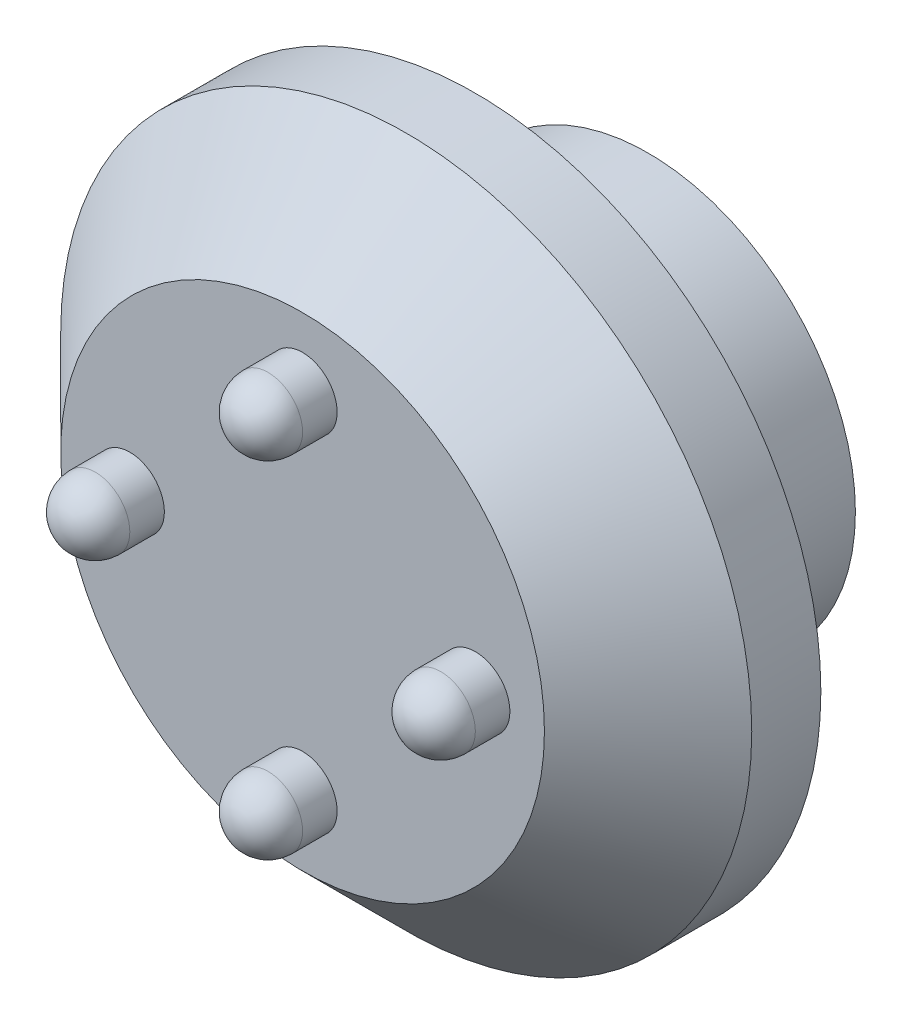
ISO-10303-21;
HEADER;
FILE_DESCRIPTION(('STEP AP214'),'2;1');
FILE_NAME('part.step','',(''),(''),'','','');
FILE_SCHEMA(('AUTOMOTIVE_DESIGN { 1 0 10303 214 1 1 1 1 }'));
ENDSEC;
DATA;
#1=APPLICATION_CONTEXT('core data for automotive mechanical design processes');
#2=APPLICATION_PROTOCOL_DEFINITION('international standard','automotive_design',2000,#1);
#3=PRODUCT_CONTEXT('',#1,'mechanical');
#4=PRODUCT('Part','Part','',(#3));
#5=PRODUCT_RELATED_PRODUCT_CATEGORY('part','',(#4));
#6=PRODUCT_DEFINITION_FORMATION('','',#4);
#7=PRODUCT_DEFINITION_CONTEXT('part definition',#1,'design');
#8=PRODUCT_DEFINITION('design','',#6,#7);
#9=PRODUCT_DEFINITION_SHAPE('','',#8);
#10=(LENGTH_UNIT() NAMED_UNIT(*) SI_UNIT(.MILLI.,.METRE.));
#11=(NAMED_UNIT(*) PLANE_ANGLE_UNIT() SI_UNIT($,.RADIAN.));
#12=(NAMED_UNIT(*) SI_UNIT($,.STERADIAN.) SOLID_ANGLE_UNIT());
#13=UNCERTAINTY_MEASURE_WITH_UNIT(LENGTH_MEASURE(1.E-05),#10,'distance_accuracy_value','');
#14=(GEOMETRIC_REPRESENTATION_CONTEXT(3) GLOBAL_UNCERTAINTY_ASSIGNED_CONTEXT((#13)) GLOBAL_UNIT_ASSIGNED_CONTEXT((#10,
#11,#12)) REPRESENTATION_CONTEXT('',''));
#15=CARTESIAN_POINT('',(0.,0.,0.));
#16=DIRECTION('',(0.,0.,1.));
#17=DIRECTION('',(1.,0.,0.));
#18=AXIS2_PLACEMENT_3D('',#15,#16,#17);
#19=CARTESIAN_POINT('',(-4.99999999999986,-1.41802385452233E-13,7.));
#20=DIRECTION('',(0.,0.,-1.));
#21=DIRECTION('',(-1.,0.,0.));
#22=AXIS2_PLACEMENT_3D('',#19,#20,#21);
#23=CYLINDRICAL_SURFACE('',#22,1.00000000000023);
#24=CARTESIAN_POINT('',(-4.99999999999986,-1.41802385452233E-13,6.));
#25=DIRECTION('',(0.,0.,-1.));
#26=DIRECTION('',(-1.,0.,0.));
#27=AXIS2_PLACEMENT_3D('',#24,#25,#26);
#28=CIRCLE('',#27,1.00000000000023);
#29=CARTESIAN_POINT('',(-6.00000000000009,-1.41802385452233E-13,6.));
#30=VERTEX_POINT('',#29);
#31=EDGE_CURVE('E11',#30,#30,#28,.T.);
#32=ORIENTED_EDGE('',*,*,#31,.T.);
#33=EDGE_LOOP('',(#32));
#34=FACE_BOUND('',#33,.T.);
#35=CARTESIAN_POINT('',(-4.99999999999986,-1.41802385452233E-13,5.));
#36=DIRECTION('',(0.,0.,1.));
#37=DIRECTION('',(1.,0.,0.));
#38=AXIS2_PLACEMENT_3D('',#35,#36,#37);
#39=CIRCLE('',#38,1.00000000000023);
#40=CARTESIAN_POINT('',(-3.99999999999963,-1.41802385452233E-13,5.));
#41=VERTEX_POINT('',#40);
#42=EDGE_CURVE('E56',#41,#41,#39,.T.);
#43=ORIENTED_EDGE('',*,*,#42,.T.);
#44=EDGE_LOOP('',(#43));
#45=FACE_BOUND('',#44,.T.);
#46=ADVANCED_FACE('F49',(#34,#45),#23,.T.);
#47=CARTESIAN_POINT('',(-4.99999999999986,-1.41802385452233E-13,5.));
#48=DIRECTION('',(0.,0.,1.));
#49=DIRECTION('',(1.,0.,0.));
#50=AXIS2_PLACEMENT_3D('',#47,#48,#49);
#51=PLANE('',#50);
#52=ORIENTED_EDGE('',*,*,#42,.F.);
#53=EDGE_LOOP('',(#52));
#54=FACE_BOUND('',#53,.T.);
#55=ADVANCED_FACE('F63',(#54),#51,.F.);
#56=CARTESIAN_POINT('',(-4.99999999999986,-1.41802385452233E-13,6.));
#57=DIRECTION('',(0.,0.,1.));
#58=DIRECTION('',(1.,0.,0.));
#59=AXIS2_PLACEMENT_3D('',#56,#57,#58);
#60=SPHERICAL_SURFACE('',#59,1.);
#61=ORIENTED_EDGE('',*,*,#31,.F.);
#62=EDGE_LOOP('',(#61));
#63=FACE_BOUND('',#62,.T.);
#64=ADVANCED_FACE('F51',(#63),#60,.T.);
#65=CLOSED_SHELL('',(#46,#55,#64));
#66=MANIFOLD_SOLID_BREP('B2',#65);
#67=CARTESIAN_POINT('',(2.82380124105319E-13,-5.,7.));
#68=DIRECTION('',(0.,0.,-1.));
#69=DIRECTION('',(-1.,0.,0.));
#70=AXIS2_PLACEMENT_3D('',#67,#68,#69);
#71=CYLINDRICAL_SURFACE('',#70,1.0000000000003);
#72=CARTESIAN_POINT('',(2.82380124105319E-13,-5.,6.));
#73=DIRECTION('',(0.,0.,-1.));
#74=DIRECTION('',(-1.,0.,0.));
#75=AXIS2_PLACEMENT_3D('',#72,#73,#74);
#76=CIRCLE('',#75,1.0000000000003);
#77=CARTESIAN_POINT('',(-1.00000000000002,-5.,6.));
#78=VERTEX_POINT('',#77);
#79=EDGE_CURVE('E48',#78,#78,#76,.T.);
#80=ORIENTED_EDGE('',*,*,#79,.T.);
#81=EDGE_LOOP('',(#80));
#82=FACE_BOUND('',#81,.T.);
#83=CARTESIAN_POINT('',(2.82380124105319E-13,-5.,5.));
#84=DIRECTION('',(0.,0.,1.));
#85=DIRECTION('',(1.,0.,0.));
#86=AXIS2_PLACEMENT_3D('',#83,#84,#85);
#87=CIRCLE('',#86,1.0000000000003);
#88=CARTESIAN_POINT('',(1.00000000000059,-5.,5.));
#89=VERTEX_POINT('',#88);
#90=EDGE_CURVE('E104',#89,#89,#87,.T.);
#91=ORIENTED_EDGE('',*,*,#90,.T.);
#92=EDGE_LOOP('',(#91));
#93=FACE_BOUND('',#92,.T.);
#94=ADVANCED_FACE('F97',(#82,#93),#71,.T.);
#95=CARTESIAN_POINT('',(2.82380124105319E-13,-5.,5.));
#96=DIRECTION('',(0.,0.,1.));
#97=DIRECTION('',(1.,0.,0.));
#98=AXIS2_PLACEMENT_3D('',#95,#96,#97);
#99=PLANE('',#98);
#100=ORIENTED_EDGE('',*,*,#90,.F.);
#101=EDGE_LOOP('',(#100));
#102=FACE_BOUND('',#101,.T.);
#103=ADVANCED_FACE('F111',(#102),#99,.F.);
#104=CARTESIAN_POINT('',(2.82380124105319E-13,-5.,6.));
#105=DIRECTION('',(0.,0.,1.));
#106=DIRECTION('',(1.,0.,0.));
#107=AXIS2_PLACEMENT_3D('',#104,#105,#106);
#108=SPHERICAL_SURFACE('',#107,1.);
#109=ORIENTED_EDGE('',*,*,#79,.F.);
#110=EDGE_LOOP('',(#109));
#111=FACE_BOUND('',#110,.T.);
#112=ADVANCED_FACE('F99',(#111),#108,.T.);
#113=CLOSED_SHELL('',(#94,#103,#112));
#114=MANIFOLD_SOLID_BREP('B6',#113);
#115=CARTESIAN_POINT('',(5.00000000000014,1.4119006205266E-13,7.));
#116=DIRECTION('',(0.,0.,-1.));
#117=DIRECTION('',(-1.,0.,0.));
#118=AXIS2_PLACEMENT_3D('',#115,#116,#117);
#119=CYLINDRICAL_SURFACE('',#118,1.00000000000011);
#120=CARTESIAN_POINT('',(5.00000000000014,1.4119006205266E-13,6.));
#121=DIRECTION('',(0.,0.,-1.));
#122=DIRECTION('',(-1.,0.,0.));
#123=AXIS2_PLACEMENT_3D('',#120,#121,#122);
#124=CIRCLE('',#123,1.00000000000011);
#125=CARTESIAN_POINT('',(4.00000000000003,1.4119006205266E-13,6.));
#126=VERTEX_POINT('',#125);
#127=EDGE_CURVE('E96',#126,#126,#124,.T.);
#128=ORIENTED_EDGE('',*,*,#127,.T.);
#129=EDGE_LOOP('',(#128));
#130=FACE_BOUND('',#129,.T.);
#131=CARTESIAN_POINT('',(5.00000000000014,1.4119006205266E-13,5.));
#132=DIRECTION('',(0.,0.,1.));
#133=DIRECTION('',(1.,0.,0.));
#134=AXIS2_PLACEMENT_3D('',#131,#132,#133);
#135=CIRCLE('',#134,1.00000000000011);
#136=CARTESIAN_POINT('',(6.00000000000025,1.4119006205266E-13,5.));
#137=VERTEX_POINT('',#136);
#138=EDGE_CURVE('E152',#137,#137,#135,.T.);
#139=ORIENTED_EDGE('',*,*,#138,.T.);
#140=EDGE_LOOP('',(#139));
#141=FACE_BOUND('',#140,.T.);
#142=ADVANCED_FACE('F145',(#130,#141),#119,.T.);
#143=CARTESIAN_POINT('',(5.00000000000014,1.4119006205266E-13,5.));
#144=DIRECTION('',(0.,0.,1.));
#145=DIRECTION('',(1.,0.,0.));
#146=AXIS2_PLACEMENT_3D('',#143,#144,#145);
#147=PLANE('',#146);
#148=ORIENTED_EDGE('',*,*,#138,.F.);
#149=EDGE_LOOP('',(#148));
#150=FACE_BOUND('',#149,.T.);
#151=ADVANCED_FACE('F159',(#150),#147,.F.);
#152=CARTESIAN_POINT('',(5.00000000000014,1.4119006205266E-13,6.));
#153=DIRECTION('',(0.,0.,1.));
#154=DIRECTION('',(1.,0.,0.));
#155=AXIS2_PLACEMENT_3D('',#152,#153,#154);
#156=SPHERICAL_SURFACE('',#155,1.);
#157=ORIENTED_EDGE('',*,*,#127,.F.);
#158=EDGE_LOOP('',(#157));
#159=FACE_BOUND('',#158,.T.);
#160=ADVANCED_FACE('F147',(#159),#156,.T.);
#161=CLOSED_SHELL('',(#142,#151,#160));
#162=MANIFOLD_SOLID_BREP('B43',#161);
#163=CARTESIAN_POINT('',(0.,5.,7.));
#164=DIRECTION('',(0.,0.,-1.));
#165=DIRECTION('',(-1.,0.,0.));
#166=AXIS2_PLACEMENT_3D('',#163,#164,#165);
#167=CYLINDRICAL_SURFACE('',#166,1.);
#168=CARTESIAN_POINT('',(0.,5.,6.));
#169=DIRECTION('',(0.,0.,-1.));
#170=DIRECTION('',(-1.,0.,0.));
#171=AXIS2_PLACEMENT_3D('',#168,#169,#170);
#172=CIRCLE('',#171,1.);
#173=CARTESIAN_POINT('',(-1.,5.,6.));
#174=VERTEX_POINT('',#173);
#175=EDGE_CURVE('E144',#174,#174,#172,.T.);
#176=ORIENTED_EDGE('',*,*,#175,.T.);
#177=EDGE_LOOP('',(#176));
#178=FACE_BOUND('',#177,.T.);
#179=CARTESIAN_POINT('',(0.,5.,5.));
#180=DIRECTION('',(0.,0.,1.));
#181=DIRECTION('',(1.,0.,0.));
#182=AXIS2_PLACEMENT_3D('',#179,#180,#181);
#183=CIRCLE('',#182,1.);
#184=CARTESIAN_POINT('',(1.,5.,5.));
#185=VERTEX_POINT('',#184);
#186=EDGE_CURVE('E199',#185,#185,#183,.T.);
#187=ORIENTED_EDGE('',*,*,#186,.T.);
#188=EDGE_LOOP('',(#187));
#189=FACE_BOUND('',#188,.T.);
#190=ADVANCED_FACE('F192',(#178,#189),#167,.T.);
#191=CARTESIAN_POINT('',(0.,5.,5.));
#192=DIRECTION('',(0.,0.,1.));
#193=DIRECTION('',(1.,0.,0.));
#194=AXIS2_PLACEMENT_3D('',#191,#192,#193);
#195=PLANE('',#194);
#196=ORIENTED_EDGE('',*,*,#186,.F.);
#197=EDGE_LOOP('',(#196));
#198=FACE_BOUND('',#197,.T.);
#199=ADVANCED_FACE('F206',(#198),#195,.F.);
#200=CARTESIAN_POINT('',(0.,5.,6.));
#201=DIRECTION('',(0.,0.,1.));
#202=DIRECTION('',(1.,0.,0.));
#203=AXIS2_PLACEMENT_3D('',#200,#201,#202);
#204=SPHERICAL_SURFACE('',#203,1.);
#205=ORIENTED_EDGE('',*,*,#175,.F.);
#206=EDGE_LOOP('',(#205));
#207=FACE_BOUND('',#206,.T.);
#208=ADVANCED_FACE('F194',(#207),#204,.T.);
#209=CLOSED_SHELL('',(#190,#199,#208));
#210=MANIFOLD_SOLID_BREP('B91',#209);
#211=CARTESIAN_POINT('',(0.,0.,5.));
#212=DIRECTION('',(0.,0.,-1.));
#213=DIRECTION('',(-1.,0.,0.));
#214=AXIS2_PLACEMENT_3D('',#211,#212,#213);
#215=CYLINDRICAL_SURFACE('',#214,6.);
#216=CARTESIAN_POINT('',(0.,0.,-5.));
#217=DIRECTION('',(0.,0.,1.));
#218=DIRECTION('',(1.,0.,0.));
#219=AXIS2_PLACEMENT_3D('',#216,#217,#218);
#220=CIRCLE('',#219,6.);
#221=CARTESIAN_POINT('',(6.,0.,-5.));
#222=VERTEX_POINT('',#221);
#223=EDGE_CURVE('E249',#222,#222,#220,.T.);
#224=ORIENTED_EDGE('',*,*,#223,.T.);
#225=EDGE_LOOP('',(#224));
#226=FACE_BOUND('',#225,.T.);
#227=CARTESIAN_POINT('',(0.,0.,0.));
#228=DIRECTION('',(0.,0.,1.));
#229=DIRECTION('',(1.,0.,0.));
#230=AXIS2_PLACEMENT_3D('',#227,#228,#229);
#231=CIRCLE('',#230,6.);
#232=CARTESIAN_POINT('',(6.,0.,0.));
#233=VERTEX_POINT('',#232);
#234=EDGE_CURVE('E245',#233,#233,#231,.T.);
#235=ORIENTED_EDGE('',*,*,#234,.F.);
#236=EDGE_LOOP('',(#235));
#237=FACE_BOUND('',#236,.T.);
#238=ADVANCED_FACE('F233',(#226,#237),#215,.T.);
#239=CARTESIAN_POINT('',(0.,0.,5.));
#240=DIRECTION('',(0.,0.,-1.));
#241=DIRECTION('',(-1.,0.,0.));
#242=AXIS2_PLACEMENT_3D('',#239,#240,#241);
#243=CYLINDRICAL_SURFACE('',#242,3.25);
#244=CARTESIAN_POINT('',(0.,0.,-5.));
#245=DIRECTION('',(0.,0.,1.));
#246=DIRECTION('',(1.,0.,0.));
#247=AXIS2_PLACEMENT_3D('',#244,#245,#246);
#248=CIRCLE('',#247,3.25);
#249=CARTESIAN_POINT('',(3.25000000000001,0.,-5.));
#250=VERTEX_POINT('',#249);
#251=EDGE_CURVE('E255',#250,#250,#248,.T.);
#252=ORIENTED_EDGE('',*,*,#251,.F.);
#253=EDGE_LOOP('',(#252));
#254=FACE_BOUND('',#253,.T.);
#255=CARTESIAN_POINT('',(0.,0.,0.));
#256=DIRECTION('',(0.,0.,1.));
#257=DIRECTION('',(1.,0.,0.));
#258=AXIS2_PLACEMENT_3D('',#255,#256,#257);
#259=CIRCLE('',#258,3.25);
#260=CARTESIAN_POINT('',(3.25000000000001,0.,0.));
#261=VERTEX_POINT('',#260);
#262=EDGE_CURVE('E252',#261,#261,#259,.T.);
#263=ORIENTED_EDGE('',*,*,#262,.T.);
#264=EDGE_LOOP('',(#263));
#265=FACE_BOUND('',#264,.T.);
#266=ADVANCED_FACE('F282',(#254,#265),#243,.F.);
#267=CARTESIAN_POINT('',(0.,0.,-5.));
#268=DIRECTION('',(0.,0.,1.));
#269=DIRECTION('',(1.,0.,0.));
#270=AXIS2_PLACEMENT_3D('',#267,#268,#269);
#271=PLANE('',#270);
#272=ORIENTED_EDGE('',*,*,#251,.T.);
#273=EDGE_LOOP('',(#272));
#274=FACE_BOUND('',#273,.T.);
#275=ORIENTED_EDGE('',*,*,#223,.F.);
#276=EDGE_LOOP('',(#275));
#277=FACE_BOUND('',#276,.T.);
#278=ADVANCED_FACE('F279',(#274,#277),#271,.F.);
#279=CARTESIAN_POINT('',(0.,0.,0.));
#280=DIRECTION('',(0.,0.,1.));
#281=DIRECTION('',(1.,0.,0.));
#282=AXIS2_PLACEMENT_3D('',#279,#280,#281);
#283=PLANE('',#282);
#284=ORIENTED_EDGE('',*,*,#262,.F.);
#285=EDGE_LOOP('',(#284));
#286=FACE_BOUND('',#285,.T.);
#287=ADVANCED_FACE('F271',(#286),#283,.F.);
#288=CARTESIAN_POINT('',(0.,0.,5.));
#289=DIRECTION('',(0.,0.,-1.));
#290=DIRECTION('',(-1.,0.,0.));
#291=AXIS2_PLACEMENT_3D('',#288,#289,#290);
#292=CYLINDRICAL_SURFACE('',#291,10.0000001490116);
#293=CARTESIAN_POINT('',(0.,0.,1.99999999999999));
#294=DIRECTION('',(0.,0.,1.));
#295=DIRECTION('',(1.,0.,0.));
#296=AXIS2_PLACEMENT_3D('',#293,#294,#295);
#297=CIRCLE('',#296,10.0000001490116);
#298=CARTESIAN_POINT('',(10.0000001490117,0.,1.99999999999999));
#299=VERTEX_POINT('',#298);
#300=EDGE_CURVE('E191',#299,#299,#297,.F.);
#301=ORIENTED_EDGE('',*,*,#300,.T.);
#302=EDGE_LOOP('',(#301));
#303=FACE_BOUND('',#302,.T.);
#304=CARTESIAN_POINT('',(0.,0.,0.));
#305=DIRECTION('',(0.,0.,1.));
#306=DIRECTION('',(1.,0.,0.));
#307=AXIS2_PLACEMENT_3D('',#304,#305,#306);
#308=CIRCLE('',#307,10.0000001490116);
#309=CARTESIAN_POINT('',(10.0000001490117,0.,0.));
#310=VERTEX_POINT('',#309);
#311=EDGE_CURVE('E256',#310,#310,#308,.T.);
#312=ORIENTED_EDGE('',*,*,#311,.T.);
#313=EDGE_LOOP('',(#312));
#314=FACE_BOUND('',#313,.T.);
#315=ADVANCED_FACE('F264',(#303,#314),#292,.T.);
#316=ORIENTED_EDGE('',*,*,#234,.T.);
#317=EDGE_LOOP('',(#316));
#318=FACE_BOUND('',#317,.T.);
#319=ORIENTED_EDGE('',*,*,#311,.F.);
#320=EDGE_LOOP('',(#319));
#321=FACE_BOUND('',#320,.T.);
#322=ADVANCED_FACE('F266',(#318,#321),#283,.F.);
#323=CARTESIAN_POINT('',(0.,0.,5.));
#324=DIRECTION('',(0.,0.,1.));
#325=DIRECTION('',(1.,0.,0.));
#326=AXIS2_PLACEMENT_3D('',#323,#324,#325);
#327=PLANE('',#326);
#328=CARTESIAN_POINT('',(0.,0.,5.));
#329=DIRECTION('',(0.,0.,1.));
#330=DIRECTION('',(1.,0.,0.));
#331=AXIS2_PLACEMENT_3D('',#328,#329,#330);
#332=CIRCLE('',#331,7.00000014901165);
#333=CARTESIAN_POINT('',(7.00000014901166,0.,5.));
#334=VERTEX_POINT('',#333);
#335=EDGE_CURVE('E241',#334,#334,#332,.T.);
#336=ORIENTED_EDGE('',*,*,#335,.T.);
#337=EDGE_LOOP('',(#336));
#338=FACE_BOUND('',#337,.T.);
#339=ADVANCED_FACE('F268',(#338),#327,.T.);
#340=CARTESIAN_POINT('',(0.,0.,5.));
#341=DIRECTION('',(0.,0.,-1.));
#342=DIRECTION('',(-1.,0.,0.));
#343=AXIS2_PLACEMENT_3D('',#340,#341,#342);
#344=CONICAL_SURFACE('',#343,7.00000014901165,0.785398163397447);
#345=ORIENTED_EDGE('',*,*,#300,.F.);
#346=EDGE_LOOP('',(#345));
#347=FACE_BOUND('',#346,.T.);
#348=ORIENTED_EDGE('',*,*,#335,.F.);
#349=EDGE_LOOP('',(#348));
#350=FACE_BOUND('',#349,.T.);
#351=ADVANCED_FACE('F236',(#347,#350),#344,.T.);
#352=CLOSED_SHELL('',(#238,#266,#278,#287,#315,#322,#339,#351));
#353=MANIFOLD_SOLID_BREP('B139',#352);
#354=ADVANCED_BREP_SHAPE_REPRESENTATION('',(#18,#66,#114,#162,#210,#353),#14);
#355=SHAPE_DEFINITION_REPRESENTATION(#9,#354);
ENDSEC;
END-ISO-10303-21;
